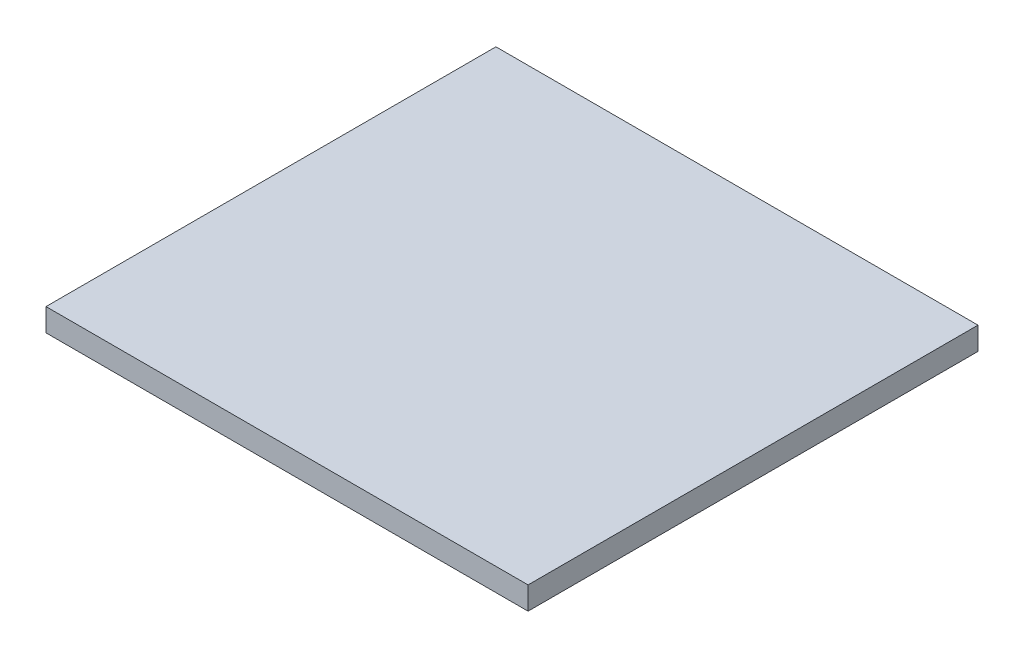
ISO-10303-21;
HEADER;
FILE_DESCRIPTION(('STEP AP214'),'2;1');
FILE_NAME('part.step','',(''),(''),'','','');
FILE_SCHEMA(('AUTOMOTIVE_DESIGN { 1 0 10303 214 1 1 1 1 }'));
ENDSEC;
DATA;
#1=APPLICATION_CONTEXT('core data for automotive mechanical design processes');
#2=APPLICATION_PROTOCOL_DEFINITION('international standard','automotive_design',2000,#1);
#3=PRODUCT_CONTEXT('',#1,'mechanical');
#4=PRODUCT('Part','Part','',(#3));
#5=PRODUCT_RELATED_PRODUCT_CATEGORY('part','',(#4));
#6=PRODUCT_DEFINITION_FORMATION('','',#4);
#7=PRODUCT_DEFINITION_CONTEXT('part definition',#1,'design');
#8=PRODUCT_DEFINITION('design','',#6,#7);
#9=PRODUCT_DEFINITION_SHAPE('','',#8);
#10=(LENGTH_UNIT() NAMED_UNIT(*) SI_UNIT(.MILLI.,.METRE.));
#11=(NAMED_UNIT(*) PLANE_ANGLE_UNIT() SI_UNIT($,.RADIAN.));
#12=(NAMED_UNIT(*) SI_UNIT($,.STERADIAN.) SOLID_ANGLE_UNIT());
#13=UNCERTAINTY_MEASURE_WITH_UNIT(LENGTH_MEASURE(1.E-05),#10,'distance_accuracy_value','');
#14=(GEOMETRIC_REPRESENTATION_CONTEXT(3) GLOBAL_UNCERTAINTY_ASSIGNED_CONTEXT((#13)) GLOBAL_UNIT_ASSIGNED_CONTEXT((#10,
#11,#12)) REPRESENTATION_CONTEXT('',''));
#15=CARTESIAN_POINT('',(0.,0.,0.));
#16=DIRECTION('',(0.,0.,1.));
#17=DIRECTION('',(1.,0.,0.));
#18=AXIS2_PLACEMENT_3D('',#15,#16,#17);
#19=CARTESIAN_POINT('',(-5.5499,2.9756,5.1029));
#20=DIRECTION('',(1.,0.,0.));
#21=DIRECTION('',(0.,-1.,0.));
#22=AXIS2_PLACEMENT_3D('',#19,#20,#21);
#23=PLANE('',#22);
#24=DIRECTION('',(0.,0.,1.));
#25=VECTOR('',#24,1.);
#26=CARTESIAN_POINT('',(-5.5499,2.9306,5.1029));
#27=LINE('',#26,#25);
#28=CARTESIAN_POINT('',(-5.5499,2.9306,4.2139));
#29=VERTEX_POINT('',#28);
#30=CARTESIAN_POINT('',(-5.5499,2.9306,5.1029));
#31=VERTEX_POINT('',#30);
#32=EDGE_CURVE('E11',#29,#31,#27,.T.);
#33=ORIENTED_EDGE('',*,*,#32,.T.);
#34=DIRECTION('',(0.,-1.,0.));
#35=VECTOR('',#34,1.);
#36=CARTESIAN_POINT('',(-5.5499,2.9756,5.1029));
#37=LINE('',#36,#35);
#38=CARTESIAN_POINT('',(-5.5499,2.9756,5.1029));
#39=VERTEX_POINT('',#38);
#40=EDGE_CURVE('E24',#39,#31,#37,.T.);
#41=ORIENTED_EDGE('',*,*,#40,.F.);
#42=DIRECTION('',(0.,0.,1.));
#43=VECTOR('',#42,1.);
#44=CARTESIAN_POINT('',(-5.5499,2.9756,5.1029));
#45=LINE('',#44,#43);
#46=CARTESIAN_POINT('',(-5.5499,2.9756,4.2139));
#47=VERTEX_POINT('',#46);
#48=EDGE_CURVE('E88',#47,#39,#45,.T.);
#49=ORIENTED_EDGE('',*,*,#48,.F.);
#50=DIRECTION('',(0.,-1.,0.));
#51=VECTOR('',#50,1.);
#52=CARTESIAN_POINT('',(-5.5499,2.9756,4.2139));
#53=LINE('',#52,#51);
#54=EDGE_CURVE('E77',#47,#29,#53,.T.);
#55=ORIENTED_EDGE('',*,*,#54,.T.);
#56=EDGE_LOOP('',(#33,#41,#49,#55));
#57=FACE_BOUND('',#56,.T.);
#58=ADVANCED_FACE('F17',(#57),#23,.F.);
#59=CARTESIAN_POINT('',(-4.5974,2.9756,5.1029));
#60=DIRECTION('',(0.,0.,-1.));
#61=DIRECTION('',(0.,1.,0.));
#62=AXIS2_PLACEMENT_3D('',#59,#60,#61);
#63=PLANE('',#62);
#64=DIRECTION('',(1.,0.,0.));
#65=VECTOR('',#64,1.);
#66=CARTESIAN_POINT('',(-4.5974,2.9306,5.1029));
#67=LINE('',#66,#65);
#68=CARTESIAN_POINT('',(-4.5974,2.9306,5.1029));
#69=VERTEX_POINT('',#68);
#70=EDGE_CURVE('E85',#31,#69,#67,.T.);
#71=ORIENTED_EDGE('',*,*,#70,.T.);
#72=DIRECTION('',(0.,-1.,0.));
#73=VECTOR('',#72,1.);
#74=CARTESIAN_POINT('',(-4.5974,2.9756,5.1029));
#75=LINE('',#74,#73);
#76=CARTESIAN_POINT('',(-4.5974,2.9756,5.1029));
#77=VERTEX_POINT('',#76);
#78=EDGE_CURVE('E83',#77,#69,#75,.T.);
#79=ORIENTED_EDGE('',*,*,#78,.F.);
#80=DIRECTION('',(1.,0.,0.));
#81=VECTOR('',#80,1.);
#82=CARTESIAN_POINT('',(-4.5974,2.9756,5.1029));
#83=LINE('',#82,#81);
#84=EDGE_CURVE('E72',#39,#77,#83,.T.);
#85=ORIENTED_EDGE('',*,*,#84,.F.);
#86=ORIENTED_EDGE('',*,*,#40,.T.);
#87=EDGE_LOOP('',(#71,#79,#85,#86));
#88=FACE_BOUND('',#87,.T.);
#89=ADVANCED_FACE('F90',(#88),#63,.F.);
#90=CARTESIAN_POINT('',(-4.5974,2.9756,4.2139));
#91=DIRECTION('',(-1.,0.,0.));
#92=DIRECTION('',(0.,1.,0.));
#93=AXIS2_PLACEMENT_3D('',#90,#91,#92);
#94=PLANE('',#93);
#95=DIRECTION('',(0.,0.,-1.));
#96=VECTOR('',#95,1.);
#97=CARTESIAN_POINT('',(-4.5974,2.9306,4.2139));
#98=LINE('',#97,#96);
#99=CARTESIAN_POINT('',(-4.5974,2.9306,4.2139));
#100=VERTEX_POINT('',#99);
#101=EDGE_CURVE('E60',#69,#100,#98,.T.);
#102=ORIENTED_EDGE('',*,*,#101,.T.);
#103=DIRECTION('',(0.,-1.,0.));
#104=VECTOR('',#103,1.);
#105=CARTESIAN_POINT('',(-4.5974,2.9756,4.2139));
#106=LINE('',#105,#104);
#107=CARTESIAN_POINT('',(-4.5974,2.9756,4.2139));
#108=VERTEX_POINT('',#107);
#109=EDGE_CURVE('E54',#108,#100,#106,.T.);
#110=ORIENTED_EDGE('',*,*,#109,.F.);
#111=DIRECTION('',(0.,0.,-1.));
#112=VECTOR('',#111,1.);
#113=CARTESIAN_POINT('',(-4.5974,2.9756,4.2139));
#114=LINE('',#113,#112);
#115=EDGE_CURVE('E58',#77,#108,#114,.T.);
#116=ORIENTED_EDGE('',*,*,#115,.F.);
#117=ORIENTED_EDGE('',*,*,#78,.T.);
#118=EDGE_LOOP('',(#102,#110,#116,#117));
#119=FACE_BOUND('',#118,.T.);
#120=ADVANCED_FACE('F56',(#119),#94,.F.);
#121=CARTESIAN_POINT('',(-5.5499,2.9756,4.2139));
#122=DIRECTION('',(0.,0.,1.));
#123=DIRECTION('',(0.,-1.,0.));
#124=AXIS2_PLACEMENT_3D('',#121,#122,#123);
#125=PLANE('',#124);
#126=DIRECTION('',(-1.,0.,0.));
#127=VECTOR('',#126,1.);
#128=CARTESIAN_POINT('',(-5.5499,2.9306,4.2139));
#129=LINE('',#128,#127);
#130=EDGE_CURVE('E73',#100,#29,#129,.T.);
#131=ORIENTED_EDGE('',*,*,#130,.T.);
#132=ORIENTED_EDGE('',*,*,#54,.F.);
#133=DIRECTION('',(-1.,0.,0.));
#134=VECTOR('',#133,1.);
#135=CARTESIAN_POINT('',(-5.5499,2.9756,4.2139));
#136=LINE('',#135,#134);
#137=EDGE_CURVE('E70',#108,#47,#136,.T.);
#138=ORIENTED_EDGE('',*,*,#137,.F.);
#139=ORIENTED_EDGE('',*,*,#109,.T.);
#140=EDGE_LOOP('',(#131,#132,#138,#139));
#141=FACE_BOUND('',#140,.T.);
#142=ADVANCED_FACE('F76',(#141),#125,.F.);
#143=CARTESIAN_POINT('',(0.,2.9756,0.));
#144=DIRECTION('',(0.,-1.,0.));
#145=DIRECTION('',(-1.,0.,0.));
#146=AXIS2_PLACEMENT_3D('',#143,#144,#145);
#147=PLANE('',#146);
#148=ORIENTED_EDGE('',*,*,#48,.T.);
#149=ORIENTED_EDGE('',*,*,#84,.T.);
#150=ORIENTED_EDGE('',*,*,#115,.T.);
#151=ORIENTED_EDGE('',*,*,#137,.T.);
#152=EDGE_LOOP('',(#148,#149,#150,#151));
#153=FACE_BOUND('',#152,.T.);
#154=ADVANCED_FACE('F69',(#153),#147,.F.);
#155=CARTESIAN_POINT('',(0.,2.9306,0.));
#156=DIRECTION('',(0.,-1.,0.));
#157=DIRECTION('',(-1.,0.,0.));
#158=AXIS2_PLACEMENT_3D('',#155,#156,#157);
#159=PLANE('',#158);
#160=ORIENTED_EDGE('',*,*,#32,.F.);
#161=ORIENTED_EDGE('',*,*,#130,.F.);
#162=ORIENTED_EDGE('',*,*,#101,.F.);
#163=ORIENTED_EDGE('',*,*,#70,.F.);
#164=EDGE_LOOP('',(#160,#161,#162,#163));
#165=FACE_BOUND('',#164,.T.);
#166=ADVANCED_FACE('F91',(#165),#159,.T.);
#167=CLOSED_SHELL('',(#58,#89,#120,#142,#154,#166));
#168=MANIFOLD_SOLID_BREP('B1',#167);
#169=ADVANCED_BREP_SHAPE_REPRESENTATION('',(#18,#168),#14);
#170=SHAPE_DEFINITION_REPRESENTATION(#9,#169);
ENDSEC;
END-ISO-10303-21;
